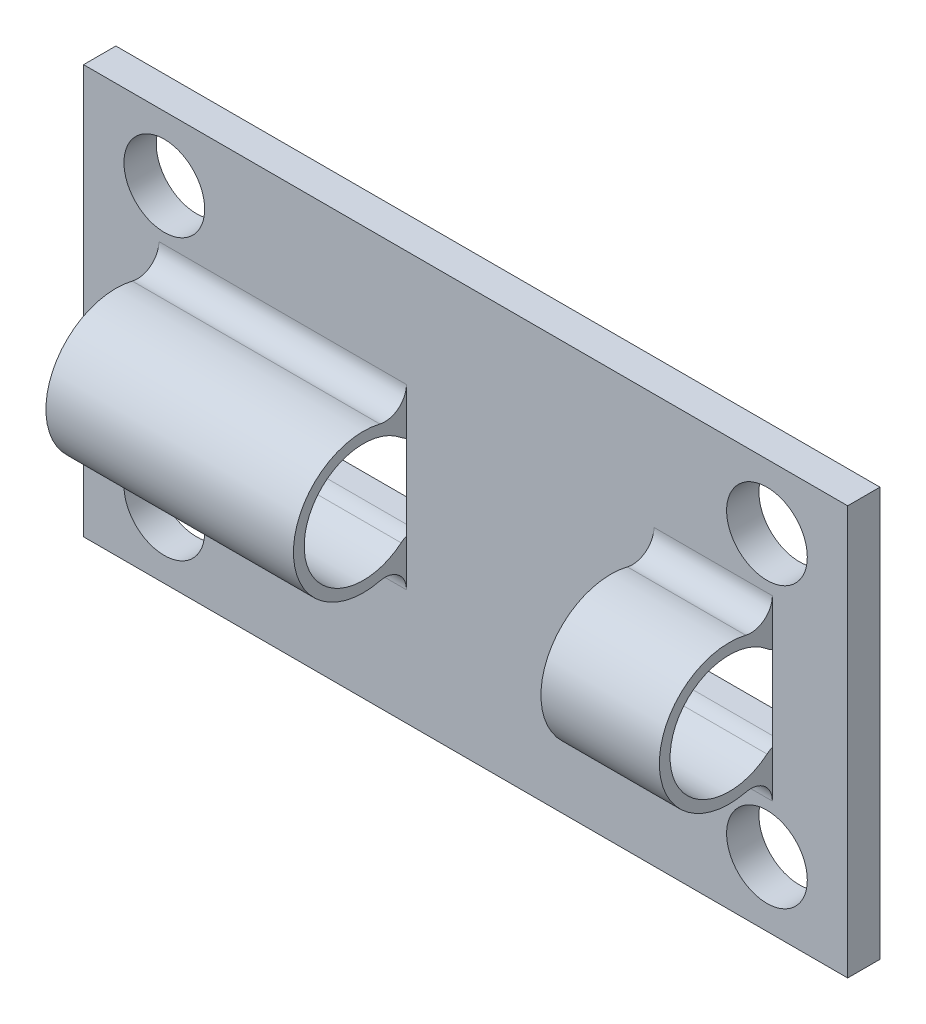
ISO-10303-21;
HEADER;
FILE_DESCRIPTION(('STEP AP214'),'2;1');
FILE_NAME('part.step','',(''),(''),'','','');
FILE_SCHEMA(('AUTOMOTIVE_DESIGN { 1 0 10303 214 1 1 1 1 }'));
ENDSEC;
DATA;
#1=APPLICATION_CONTEXT('core data for automotive mechanical design processes');
#2=APPLICATION_PROTOCOL_DEFINITION('international standard','automotive_design',2000,#1);
#3=PRODUCT_CONTEXT('',#1,'mechanical');
#4=PRODUCT('Part','Part','',(#3));
#5=PRODUCT_RELATED_PRODUCT_CATEGORY('part','',(#4));
#6=PRODUCT_DEFINITION_FORMATION('','',#4);
#7=PRODUCT_DEFINITION_CONTEXT('part definition',#1,'design');
#8=PRODUCT_DEFINITION('design','',#6,#7);
#9=PRODUCT_DEFINITION_SHAPE('','',#8);
#10=(LENGTH_UNIT() NAMED_UNIT(*) SI_UNIT(.MILLI.,.METRE.));
#11=(NAMED_UNIT(*) PLANE_ANGLE_UNIT() SI_UNIT($,.RADIAN.));
#12=(NAMED_UNIT(*) SI_UNIT($,.STERADIAN.) SOLID_ANGLE_UNIT());
#13=UNCERTAINTY_MEASURE_WITH_UNIT(LENGTH_MEASURE(1.E-05),#10,'distance_accuracy_value','');
#14=(GEOMETRIC_REPRESENTATION_CONTEXT(3) GLOBAL_UNCERTAINTY_ASSIGNED_CONTEXT((#13)) GLOBAL_UNIT_ASSIGNED_CONTEXT((#10,
#11,#12)) REPRESENTATION_CONTEXT('',''));
#15=CARTESIAN_POINT('',(0.,0.,0.));
#16=DIRECTION('',(0.,0.,1.));
#17=DIRECTION('',(1.,0.,0.));
#18=AXIS2_PLACEMENT_3D('',#15,#16,#17);
#19=CARTESIAN_POINT('',(17.5,0.,7.));
#20=DIRECTION('',(1.,0.,0.));
#21=DIRECTION('',(0.,0.,-1.));
#22=AXIS2_PLACEMENT_3D('',#19,#20,#21);
#23=CYLINDRICAL_SURFACE('',#22,6.5);
#24=CARTESIAN_POINT('',(17.5,0.,7.));
#25=DIRECTION('',(1.,0.,0.));
#26=DIRECTION('',(0.,0.,-1.));
#27=AXIS2_PLACEMENT_3D('',#24,#25,#26);
#28=CIRCLE('',#27,6.5);
#29=CARTESIAN_POINT('',(17.5,6.31750739247524,5.47058823529412));
#30=VERTEX_POINT('',#29);
#31=CARTESIAN_POINT('',(17.5,-6.31750739247523,5.47058823529412));
#32=VERTEX_POINT('',#31);
#33=EDGE_CURVE('E362',#30,#32,#28,.T.);
#34=ORIENTED_EDGE('',*,*,#33,.T.);
#35=DIRECTION('',(1.,0.,0.));
#36=VECTOR('',#35,1.);
#37=CARTESIAN_POINT('',(17.5,-6.31750739247523,5.47058823529412));
#38=LINE('',#37,#36);
#39=CARTESIAN_POINT('',(28.5,-6.31750739247523,5.47058823529412));
#40=VERTEX_POINT('',#39);
#41=EDGE_CURVE('E570',#32,#40,#38,.T.);
#42=ORIENTED_EDGE('',*,*,#41,.T.);
#43=CARTESIAN_POINT('',(28.5,0.,7.));
#44=DIRECTION('',(1.,0.,0.));
#45=DIRECTION('',(0.,0.,-1.));
#46=AXIS2_PLACEMENT_3D('',#43,#44,#45);
#47=CIRCLE('',#46,6.5);
#48=CARTESIAN_POINT('',(28.5,6.31750739247524,5.47058823529412));
#49=VERTEX_POINT('',#48);
#50=EDGE_CURVE('E602',#49,#40,#47,.T.);
#51=ORIENTED_EDGE('',*,*,#50,.F.);
#52=DIRECTION('',(1.,0.,0.));
#53=VECTOR('',#52,1.);
#54=CARTESIAN_POINT('',(17.5,6.31750739247524,5.47058823529412));
#55=LINE('',#54,#53);
#56=EDGE_CURVE('E566',#49,#30,#55,.F.);
#57=ORIENTED_EDGE('',*,*,#56,.T.);
#58=EDGE_LOOP('',(#34,#42,#51,#57));
#59=FACE_BOUND('',#58,.T.);
#60=ADVANCED_FACE('F99',(#59),#23,.T.);
#61=CARTESIAN_POINT('',(17.5,0.,7.));
#62=DIRECTION('',(1.,0.,0.));
#63=DIRECTION('',(0.,0.,-1.));
#64=AXIS2_PLACEMENT_3D('',#61,#62,#63);
#65=CYLINDRICAL_SURFACE('',#64,5.5);
#66=CARTESIAN_POINT('',(28.5,0.,7.));
#67=DIRECTION('',(-1.,0.,0.));
#68=DIRECTION('',(0.,0.,-1.));
#69=AXIS2_PLACEMENT_3D('',#66,#67,#68);
#70=CIRCLE('',#69,5.5);
#71=CARTESIAN_POINT('',(28.5,-4.2349392929326,3.49068536817009));
#72=VERTEX_POINT('',#71);
#73=CARTESIAN_POINT('',(28.5,4.23493929293261,3.49068536817009));
#74=VERTEX_POINT('',#73);
#75=EDGE_CURVE('E372',#72,#74,#70,.T.);
#76=ORIENTED_EDGE('',*,*,#75,.F.);
#77=DIRECTION('',(1.,0.,0.));
#78=VECTOR('',#77,1.);
#79=CARTESIAN_POINT('',(17.5,-4.2349392929326,3.49068536817009));
#80=LINE('',#79,#78);
#81=CARTESIAN_POINT('',(17.5,-4.2349392929326,3.49068536817009));
#82=VERTEX_POINT('',#81);
#83=EDGE_CURVE('E345',#72,#82,#80,.F.);
#84=ORIENTED_EDGE('',*,*,#83,.T.);
#85=CARTESIAN_POINT('',(17.5,0.,7.));
#86=DIRECTION('',(1.,0.,0.));
#87=DIRECTION('',(0.,0.,-1.));
#88=AXIS2_PLACEMENT_3D('',#85,#86,#87);
#89=CIRCLE('',#88,5.5);
#90=CARTESIAN_POINT('',(17.5,4.23493929293261,3.49068536817009));
#91=VERTEX_POINT('',#90);
#92=EDGE_CURVE('E352',#91,#82,#89,.T.);
#93=ORIENTED_EDGE('',*,*,#92,.F.);
#94=DIRECTION('',(1.,0.,0.));
#95=VECTOR('',#94,1.);
#96=CARTESIAN_POINT('',(17.5,4.23493929293261,3.49068536817009));
#97=LINE('',#96,#95);
#98=EDGE_CURVE('E341',#91,#74,#97,.T.);
#99=ORIENTED_EDGE('',*,*,#98,.T.);
#100=EDGE_LOOP('',(#76,#84,#93,#99));
#101=FACE_BOUND('',#100,.T.);
#102=ADVANCED_FACE('F358',(#101),#65,.F.);
#103=CARTESIAN_POINT('',(-5.5,0.,7.));
#104=DIRECTION('',(-1.,0.,0.));
#105=DIRECTION('',(0.,0.,1.));
#106=AXIS2_PLACEMENT_3D('',#103,#104,#105);
#107=CYLINDRICAL_SURFACE('',#106,6.5);
#108=CARTESIAN_POINT('',(-28.5,0.,7.));
#109=DIRECTION('',(-1.,0.,0.));
#110=DIRECTION('',(0.,0.,1.));
#111=AXIS2_PLACEMENT_3D('',#108,#109,#110);
#112=CIRCLE('',#111,6.5);
#113=CARTESIAN_POINT('',(-28.5,-6.31750739247523,5.47058823529412));
#114=VERTEX_POINT('',#113);
#115=CARTESIAN_POINT('',(-28.5,6.31750739247524,5.47058823529412));
#116=VERTEX_POINT('',#115);
#117=EDGE_CURVE('E394',#114,#116,#112,.T.);
#118=ORIENTED_EDGE('',*,*,#117,.F.);
#119=DIRECTION('',(-1.,0.,0.));
#120=VECTOR('',#119,1.);
#121=CARTESIAN_POINT('',(-5.5,-6.31750739247523,5.47058823529412));
#122=LINE('',#121,#120);
#123=CARTESIAN_POINT('',(-5.5,-6.31750739247523,5.47058823529412));
#124=VERTEX_POINT('',#123);
#125=EDGE_CURVE('E562',#114,#124,#122,.F.);
#126=ORIENTED_EDGE('',*,*,#125,.T.);
#127=CARTESIAN_POINT('',(-5.5,0.,7.));
#128=DIRECTION('',(-1.,0.,0.));
#129=DIRECTION('',(0.,0.,1.));
#130=AXIS2_PLACEMENT_3D('',#127,#128,#129);
#131=CIRCLE('',#130,6.5);
#132=CARTESIAN_POINT('',(-5.5,6.31750739247524,5.47058823529412));
#133=VERTEX_POINT('',#132);
#134=EDGE_CURVE('E363',#124,#133,#131,.T.);
#135=ORIENTED_EDGE('',*,*,#134,.T.);
#136=DIRECTION('',(-1.,0.,0.));
#137=VECTOR('',#136,1.);
#138=CARTESIAN_POINT('',(-5.5,6.31750739247524,5.47058823529412));
#139=LINE('',#138,#137);
#140=EDGE_CURVE('E558',#133,#116,#139,.T.);
#141=ORIENTED_EDGE('',*,*,#140,.T.);
#142=EDGE_LOOP('',(#118,#126,#135,#141));
#143=FACE_BOUND('',#142,.T.);
#144=ADVANCED_FACE('F704',(#143),#107,.T.);
#145=CARTESIAN_POINT('',(-5.5,0.,7.));
#146=DIRECTION('',(-1.,0.,0.));
#147=DIRECTION('',(0.,0.,1.));
#148=AXIS2_PLACEMENT_3D('',#145,#146,#147);
#149=CYLINDRICAL_SURFACE('',#148,5.5);
#150=CARTESIAN_POINT('',(-28.5,0.,7.));
#151=DIRECTION('',(1.,0.,0.));
#152=DIRECTION('',(0.,0.,1.));
#153=AXIS2_PLACEMENT_3D('',#150,#151,#152);
#154=CIRCLE('',#153,5.5);
#155=CARTESIAN_POINT('',(-28.5,4.23493929293261,3.4906853681701));
#156=VERTEX_POINT('',#155);
#157=CARTESIAN_POINT('',(-28.5,-4.2349392929326,3.4906853681701));
#158=VERTEX_POINT('',#157);
#159=EDGE_CURVE('E380',#156,#158,#154,.T.);
#160=ORIENTED_EDGE('',*,*,#159,.F.);
#161=DIRECTION('',(-1.,0.,0.));
#162=VECTOR('',#161,1.);
#163=CARTESIAN_POINT('',(-5.5,4.23493929293261,3.4906853681701));
#164=LINE('',#163,#162);
#165=CARTESIAN_POINT('',(-5.5,4.23493929293261,3.4906853681701));
#166=VERTEX_POINT('',#165);
#167=EDGE_CURVE('E326',#156,#166,#164,.F.);
#168=ORIENTED_EDGE('',*,*,#167,.T.);
#169=CARTESIAN_POINT('',(-5.5,0.,7.));
#170=DIRECTION('',(-1.,0.,0.));
#171=DIRECTION('',(0.,0.,1.));
#172=AXIS2_PLACEMENT_3D('',#169,#170,#171);
#173=CIRCLE('',#172,5.5);
#174=CARTESIAN_POINT('',(-5.5,-4.2349392929326,3.4906853681701));
#175=VERTEX_POINT('',#174);
#176=EDGE_CURVE('E446',#175,#166,#173,.T.);
#177=ORIENTED_EDGE('',*,*,#176,.F.);
#178=DIRECTION('',(-1.,0.,0.));
#179=VECTOR('',#178,1.);
#180=CARTESIAN_POINT('',(-5.5,-4.2349392929326,3.4906853681701));
#181=LINE('',#180,#179);
#182=EDGE_CURVE('E323',#175,#158,#181,.T.);
#183=ORIENTED_EDGE('',*,*,#182,.T.);
#184=EDGE_LOOP('',(#160,#168,#177,#183));
#185=FACE_BOUND('',#184,.T.);
#186=ADVANCED_FACE('F694',(#185),#149,.F.);
#187=CARTESIAN_POINT('',(0.,0.,0.));
#188=DIRECTION('',(0.,0.,-1.));
#189=DIRECTION('',(-1.,0.,0.));
#190=AXIS2_PLACEMENT_3D('',#187,#188,#189);
#191=PLANE('',#190);
#192=CARTESIAN_POINT('',(-28.,-13.,0.));
#193=DIRECTION('',(0.,0.,1.));
#194=DIRECTION('',(1.,0.,0.));
#195=AXIS2_PLACEMENT_3D('',#192,#193,#194);
#196=CIRCLE('',#195,3.75);
#197=CARTESIAN_POINT('',(-24.25,-13.,0.));
#198=VERTEX_POINT('',#197);
#199=EDGE_CURVE('E461',#198,#198,#196,.T.);
#200=ORIENTED_EDGE('',*,*,#199,.T.);
#201=EDGE_LOOP('',(#200));
#202=FACE_BOUND('',#201,.T.);
#203=CARTESIAN_POINT('',(-28.,13.,0.));
#204=DIRECTION('',(0.,0.,1.));
#205=DIRECTION('',(1.,0.,0.));
#206=AXIS2_PLACEMENT_3D('',#203,#204,#205);
#207=CIRCLE('',#206,3.75);
#208=CARTESIAN_POINT('',(-24.25,13.,0.));
#209=VERTEX_POINT('',#208);
#210=EDGE_CURVE('E477',#209,#209,#207,.T.);
#211=ORIENTED_EDGE('',*,*,#210,.T.);
#212=EDGE_LOOP('',(#211));
#213=FACE_BOUND('',#212,.T.);
#214=DIRECTION('',(0.,1.,0.));
#215=VECTOR('',#214,1.);
#216=CARTESIAN_POINT('',(-35.5,-19.,0.));
#217=LINE('',#216,#215);
#218=CARTESIAN_POINT('',(-35.5,-19.,0.));
#219=VERTEX_POINT('',#218);
#220=CARTESIAN_POINT('',(-35.5,19.,0.));
#221=VERTEX_POINT('',#220);
#222=EDGE_CURVE('E485',#219,#221,#217,.T.);
#223=ORIENTED_EDGE('',*,*,#222,.T.);
#224=DIRECTION('',(1.,0.,0.));
#225=VECTOR('',#224,1.);
#226=CARTESIAN_POINT('',(-35.5,19.,0.));
#227=LINE('',#226,#225);
#228=CARTESIAN_POINT('',(35.5,19.,0.));
#229=VERTEX_POINT('',#228);
#230=EDGE_CURVE('E510',#221,#229,#227,.T.);
#231=ORIENTED_EDGE('',*,*,#230,.T.);
#232=DIRECTION('',(0.,1.,0.));
#233=VECTOR('',#232,1.);
#234=CARTESIAN_POINT('',(35.5,-19.,0.));
#235=LINE('',#234,#233);
#236=CARTESIAN_POINT('',(35.5,-19.,0.));
#237=VERTEX_POINT('',#236);
#238=EDGE_CURVE('E514',#237,#229,#235,.T.);
#239=ORIENTED_EDGE('',*,*,#238,.F.);
#240=DIRECTION('',(1.,0.,0.));
#241=VECTOR('',#240,1.);
#242=CARTESIAN_POINT('',(-35.5,-19.,0.));
#243=LINE('',#242,#241);
#244=EDGE_CURVE('E494',#219,#237,#243,.T.);
#245=ORIENTED_EDGE('',*,*,#244,.F.);
#246=EDGE_LOOP('',(#223,#231,#239,#245));
#247=FACE_BOUND('',#246,.T.);
#248=CARTESIAN_POINT('',(28.,13.,0.));
#249=DIRECTION('',(0.,0.,1.));
#250=DIRECTION('',(1.,0.,0.));
#251=AXIS2_PLACEMENT_3D('',#248,#249,#250);
#252=CIRCLE('',#251,3.75);
#253=CARTESIAN_POINT('',(31.75,13.,0.));
#254=VERTEX_POINT('',#253);
#255=EDGE_CURVE('E469',#254,#254,#252,.T.);
#256=ORIENTED_EDGE('',*,*,#255,.T.);
#257=EDGE_LOOP('',(#256));
#258=FACE_BOUND('',#257,.T.);
#259=CARTESIAN_POINT('',(28.,-13.,0.));
#260=DIRECTION('',(0.,0.,1.));
#261=DIRECTION('',(1.,0.,0.));
#262=AXIS2_PLACEMENT_3D('',#259,#260,#261);
#263=CIRCLE('',#262,3.75000000000001);
#264=CARTESIAN_POINT('',(31.75,-13.,0.));
#265=VERTEX_POINT('',#264);
#266=EDGE_CURVE('E456',#265,#265,#263,.T.);
#267=ORIENTED_EDGE('',*,*,#266,.T.);
#268=EDGE_LOOP('',(#267));
#269=FACE_BOUND('',#268,.T.);
#270=DIRECTION('',(1.,0.,0.));
#271=VECTOR('',#270,1.);
#272=CARTESIAN_POINT('',(0.,-3.77491721763537,0.));
#273=LINE('',#272,#271);
#274=CARTESIAN_POINT('',(-28.5,-3.77491721763537,0.));
#275=VERTEX_POINT('',#274);
#276=CARTESIAN_POINT('',(-5.5,-3.77491721763537,0.));
#277=VERTEX_POINT('',#276);
#278=EDGE_CURVE('E428',#275,#277,#273,.T.);
#279=ORIENTED_EDGE('',*,*,#278,.T.);
#280=DIRECTION('',(0.,1.,0.));
#281=VECTOR('',#280,1.);
#282=CARTESIAN_POINT('',(-5.5,0.,0.));
#283=LINE('',#282,#281);
#284=CARTESIAN_POINT('',(-5.5,3.77491721763538,0.));
#285=VERTEX_POINT('',#284);
#286=EDGE_CURVE('E226',#277,#285,#283,.T.);
#287=ORIENTED_EDGE('',*,*,#286,.T.);
#288=DIRECTION('',(1.,0.,0.));
#289=VECTOR('',#288,1.);
#290=CARTESIAN_POINT('',(0.,3.77491721763538,0.));
#291=LINE('',#290,#289);
#292=CARTESIAN_POINT('',(-28.5,3.77491721763537,0.));
#293=VERTEX_POINT('',#292);
#294=EDGE_CURVE('E302',#293,#285,#291,.T.);
#295=ORIENTED_EDGE('',*,*,#294,.F.);
#296=DIRECTION('',(0.,1.,0.));
#297=VECTOR('',#296,1.);
#298=CARTESIAN_POINT('',(-28.5,0.,0.));
#299=LINE('',#298,#297);
#300=EDGE_CURVE('E424',#275,#293,#299,.T.);
#301=ORIENTED_EDGE('',*,*,#300,.F.);
#302=EDGE_LOOP('',(#279,#287,#295,#301));
#303=FACE_BOUND('',#302,.T.);
#304=DIRECTION('',(-1.,0.,0.));
#305=VECTOR('',#304,1.);
#306=CARTESIAN_POINT('',(0.,-3.77491721763537,0.));
#307=LINE('',#306,#305);
#308=CARTESIAN_POINT('',(28.5,-3.77491721763537,0.));
#309=VERTEX_POINT('',#308);
#310=CARTESIAN_POINT('',(17.5,-3.77491721763537,0.));
#311=VERTEX_POINT('',#310);
#312=EDGE_CURVE('E439',#309,#311,#307,.T.);
#313=ORIENTED_EDGE('',*,*,#312,.F.);
#314=DIRECTION('',(0.,1.,0.));
#315=VECTOR('',#314,1.);
#316=CARTESIAN_POINT('',(28.5,0.,0.));
#317=LINE('',#316,#315);
#318=CARTESIAN_POINT('',(28.5,3.77491721763538,0.));
#319=VERTEX_POINT('',#318);
#320=EDGE_CURVE('E443',#309,#319,#317,.T.);
#321=ORIENTED_EDGE('',*,*,#320,.T.);
#322=DIRECTION('',(1.,0.,0.));
#323=VECTOR('',#322,1.);
#324=CARTESIAN_POINT('',(0.,3.77491721763538,0.));
#325=LINE('',#324,#323);
#326=CARTESIAN_POINT('',(17.5,3.77491721763538,0.));
#327=VERTEX_POINT('',#326);
#328=EDGE_CURVE('E263',#327,#319,#325,.T.);
#329=ORIENTED_EDGE('',*,*,#328,.F.);
#330=DIRECTION('',(0.,1.,0.));
#331=VECTOR('',#330,1.);
#332=CARTESIAN_POINT('',(17.5,0.,0.));
#333=LINE('',#332,#331);
#334=EDGE_CURVE('E435',#311,#327,#333,.T.);
#335=ORIENTED_EDGE('',*,*,#334,.F.);
#336=EDGE_LOOP('',(#313,#321,#329,#335));
#337=FACE_BOUND('',#336,.T.);
#338=ADVANCED_FACE('F666',(#202,#213,#247,#258,#269,#303,#337),#191,.T.);
#339=CARTESIAN_POINT('',(0.,0.,3.));
#340=DIRECTION('',(0.,0.,-1.));
#341=DIRECTION('',(-1.,0.,0.));
#342=AXIS2_PLACEMENT_3D('',#339,#340,#341);
#343=PLANE('',#342);
#344=DIRECTION('',(0.,1.,0.));
#345=VECTOR('',#344,1.);
#346=CARTESIAN_POINT('',(35.5,-19.,3.));
#347=LINE('',#346,#345);
#348=CARTESIAN_POINT('',(35.5,-19.,3.));
#349=VERTEX_POINT('',#348);
#350=CARTESIAN_POINT('',(35.5,19.,3.));
#351=VERTEX_POINT('',#350);
#352=EDGE_CURVE('E498',#349,#351,#347,.T.);
#353=ORIENTED_EDGE('',*,*,#352,.T.);
#354=DIRECTION('',(1.,0.,0.));
#355=VECTOR('',#354,1.);
#356=CARTESIAN_POINT('',(-35.5,19.,3.));
#357=LINE('',#356,#355);
#358=CARTESIAN_POINT('',(-35.5,19.,3.));
#359=VERTEX_POINT('',#358);
#360=EDGE_CURVE('E493',#359,#351,#357,.T.);
#361=ORIENTED_EDGE('',*,*,#360,.F.);
#362=DIRECTION('',(0.,1.,0.));
#363=VECTOR('',#362,1.);
#364=CARTESIAN_POINT('',(-35.5,-19.,3.));
#365=LINE('',#364,#363);
#366=CARTESIAN_POINT('',(-35.5,-19.,3.));
#367=VERTEX_POINT('',#366);
#368=EDGE_CURVE('E489',#367,#359,#365,.T.);
#369=ORIENTED_EDGE('',*,*,#368,.F.);
#370=DIRECTION('',(1.,0.,0.));
#371=VECTOR('',#370,1.);
#372=CARTESIAN_POINT('',(-35.5,-19.,3.));
#373=LINE('',#372,#371);
#374=EDGE_CURVE('E502',#367,#349,#373,.T.);
#375=ORIENTED_EDGE('',*,*,#374,.T.);
#376=EDGE_LOOP('',(#353,#361,#369,#375));
#377=FACE_BOUND('',#376,.T.);
#378=DIRECTION('',(-1.,0.,0.));
#379=VECTOR('',#378,1.);
#380=CARTESIAN_POINT('',(0.,-8.26135582092915,3.));
#381=LINE('',#380,#379);
#382=CARTESIAN_POINT('',(-5.5,-8.26135582092915,3.));
#383=VERTEX_POINT('',#382);
#384=CARTESIAN_POINT('',(-28.5,-8.26135582092915,3.));
#385=VERTEX_POINT('',#384);
#386=EDGE_CURVE('E554',#383,#385,#381,.T.);
#387=ORIENTED_EDGE('',*,*,#386,.T.);
#388=DIRECTION('',(0.,-1.,0.));
#389=VECTOR('',#388,1.);
#390=CARTESIAN_POINT('',(-28.5,-3.77491721763537,3.));
#391=LINE('',#390,#389);
#392=CARTESIAN_POINT('',(-28.5,-3.93559635987922,3.));
#393=VERTEX_POINT('',#392);
#394=EDGE_CURVE('E385',#393,#385,#391,.T.);
#395=ORIENTED_EDGE('',*,*,#394,.F.);
#396=DIRECTION('',(0.,-1.,0.));
#397=VECTOR('',#396,1.);
#398=CARTESIAN_POINT('',(-28.5,3.77491721763537,3.));
#399=LINE('',#398,#397);
#400=CARTESIAN_POINT('',(-28.5,3.93559635987923,3.));
#401=VERTEX_POINT('',#400);
#402=EDGE_CURVE('E180',#401,#393,#399,.T.);
#403=ORIENTED_EDGE('',*,*,#402,.F.);
#404=DIRECTION('',(0.,-1.,0.));
#405=VECTOR('',#404,1.);
#406=CARTESIAN_POINT('',(-28.5,3.77491721763538,3.));
#407=LINE('',#406,#405);
#408=CARTESIAN_POINT('',(-28.5,8.26135582092916,3.));
#409=VERTEX_POINT('',#408);
#410=EDGE_CURVE('E228',#409,#401,#407,.T.);
#411=ORIENTED_EDGE('',*,*,#410,.F.);
#412=DIRECTION('',(-1.,0.,0.));
#413=VECTOR('',#412,1.);
#414=CARTESIAN_POINT('',(0.,8.26135582092916,3.));
#415=LINE('',#414,#413);
#416=CARTESIAN_POINT('',(-5.5,8.26135582092916,3.));
#417=VERTEX_POINT('',#416);
#418=EDGE_CURVE('E547',#409,#417,#415,.F.);
#419=ORIENTED_EDGE('',*,*,#418,.T.);
#420=DIRECTION('',(0.,1.,0.));
#421=VECTOR('',#420,1.);
#422=CARTESIAN_POINT('',(-5.5,0.,3.));
#423=LINE('',#422,#421);
#424=CARTESIAN_POINT('',(-5.5,3.93559635987923,3.));
#425=VERTEX_POINT('',#424);
#426=EDGE_CURVE('E540',#425,#417,#423,.T.);
#427=ORIENTED_EDGE('',*,*,#426,.F.);
#428=DIRECTION('',(0.,-1.,0.));
#429=VECTOR('',#428,1.);
#430=CARTESIAN_POINT('',(-5.5,3.77491721763538,3.));
#431=LINE('',#430,#429);
#432=CARTESIAN_POINT('',(-5.5,-3.93559635987922,3.));
#433=VERTEX_POINT('',#432);
#434=EDGE_CURVE('E287',#425,#433,#431,.T.);
#435=ORIENTED_EDGE('',*,*,#434,.T.);
#436=EDGE_CURVE('E544',#383,#433,#423,.T.);
#437=ORIENTED_EDGE('',*,*,#436,.F.);
#438=EDGE_LOOP('',(#387,#395,#403,#411,#419,#427,#435,#437));
#439=FACE_BOUND('',#438,.T.);
#440=DIRECTION('',(1.,0.,0.));
#441=VECTOR('',#440,1.);
#442=CARTESIAN_POINT('',(0.,-8.26135582092915,3.));
#443=LINE('',#442,#441);
#444=CARTESIAN_POINT('',(28.5,-8.26135582092915,3.));
#445=VERTEX_POINT('',#444);
#446=CARTESIAN_POINT('',(17.5,-8.26135582092915,3.));
#447=VERTEX_POINT('',#446);
#448=EDGE_CURVE('E551',#445,#447,#443,.F.);
#449=ORIENTED_EDGE('',*,*,#448,.T.);
#450=DIRECTION('',(0.,-1.,0.));
#451=VECTOR('',#450,1.);
#452=CARTESIAN_POINT('',(17.5,0.,3.));
#453=LINE('',#452,#451);
#454=CARTESIAN_POINT('',(17.5,-3.93559635987922,3.));
#455=VERTEX_POINT('',#454);
#456=EDGE_CURVE('E525',#455,#447,#453,.T.);
#457=ORIENTED_EDGE('',*,*,#456,.F.);
#458=DIRECTION('',(0.,-1.,0.));
#459=VECTOR('',#458,1.);
#460=CARTESIAN_POINT('',(17.5,0.,3.));
#461=LINE('',#460,#459);
#462=CARTESIAN_POINT('',(17.5,3.93559635987923,3.));
#463=VERTEX_POINT('',#462);
#464=EDGE_CURVE('E115',#463,#455,#461,.T.);
#465=ORIENTED_EDGE('',*,*,#464,.F.);
#466=CARTESIAN_POINT('',(17.5,8.26135582092916,3.));
#467=VERTEX_POINT('',#466);
#468=EDGE_CURVE('E354',#467,#463,#453,.T.);
#469=ORIENTED_EDGE('',*,*,#468,.F.);
#470=DIRECTION('',(1.,0.,0.));
#471=VECTOR('',#470,1.);
#472=CARTESIAN_POINT('',(0.,8.26135582092916,3.));
#473=LINE('',#472,#471);
#474=CARTESIAN_POINT('',(28.5,8.26135582092916,3.));
#475=VERTEX_POINT('',#474);
#476=EDGE_CURVE('E378',#467,#475,#473,.T.);
#477=ORIENTED_EDGE('',*,*,#476,.T.);
#478=DIRECTION('',(0.,1.,0.));
#479=VECTOR('',#478,1.);
#480=CARTESIAN_POINT('',(28.5,5.1234753829798,3.));
#481=LINE('',#480,#479);
#482=CARTESIAN_POINT('',(28.5,3.93559635987923,3.));
#483=VERTEX_POINT('',#482);
#484=EDGE_CURVE('E370',#483,#475,#481,.T.);
#485=ORIENTED_EDGE('',*,*,#484,.F.);
#486=DIRECTION('',(0.,-1.,0.));
#487=VECTOR('',#486,1.);
#488=CARTESIAN_POINT('',(28.5,0.,3.));
#489=LINE('',#488,#487);
#490=CARTESIAN_POINT('',(28.5,-3.93559635987922,3.));
#491=VERTEX_POINT('',#490);
#492=EDGE_CURVE('E123',#483,#491,#489,.T.);
#493=ORIENTED_EDGE('',*,*,#492,.T.);
#494=DIRECTION('',(0.,1.,0.));
#495=VECTOR('',#494,1.);
#496=CARTESIAN_POINT('',(28.5,-3.77491721763537,3.));
#497=LINE('',#496,#495);
#498=EDGE_CURVE('E387',#445,#491,#497,.T.);
#499=ORIENTED_EDGE('',*,*,#498,.F.);
#500=EDGE_LOOP('',(#449,#457,#465,#469,#477,#485,#493,#499));
#501=FACE_BOUND('',#500,.T.);
#502=CARTESIAN_POINT('',(-28.,13.,3.));
#503=DIRECTION('',(0.,0.,1.));
#504=DIRECTION('',(1.,0.,0.));
#505=AXIS2_PLACEMENT_3D('',#502,#503,#504);
#506=CIRCLE('',#505,3.75);
#507=CARTESIAN_POINT('',(-24.25,13.,3.));
#508=VERTEX_POINT('',#507);
#509=EDGE_CURVE('E481',#508,#508,#506,.T.);
#510=ORIENTED_EDGE('',*,*,#509,.F.);
#511=EDGE_LOOP('',(#510));
#512=FACE_BOUND('',#511,.T.);
#513=CARTESIAN_POINT('',(28.,13.,3.));
#514=DIRECTION('',(0.,0.,1.));
#515=DIRECTION('',(1.,0.,0.));
#516=AXIS2_PLACEMENT_3D('',#513,#514,#515);
#517=CIRCLE('',#516,3.75);
#518=CARTESIAN_POINT('',(31.75,13.,3.));
#519=VERTEX_POINT('',#518);
#520=EDGE_CURVE('E473',#519,#519,#517,.T.);
#521=ORIENTED_EDGE('',*,*,#520,.F.);
#522=EDGE_LOOP('',(#521));
#523=FACE_BOUND('',#522,.T.);
#524=CARTESIAN_POINT('',(-28.,-13.,3.));
#525=DIRECTION('',(0.,0.,1.));
#526=DIRECTION('',(1.,0.,0.));
#527=AXIS2_PLACEMENT_3D('',#524,#525,#526);
#528=CIRCLE('',#527,3.75);
#529=CARTESIAN_POINT('',(-24.25,-13.,3.));
#530=VERTEX_POINT('',#529);
#531=EDGE_CURVE('E465',#530,#530,#528,.T.);
#532=ORIENTED_EDGE('',*,*,#531,.F.);
#533=EDGE_LOOP('',(#532));
#534=FACE_BOUND('',#533,.T.);
#535=CARTESIAN_POINT('',(28.,-13.,3.));
#536=DIRECTION('',(0.,0.,1.));
#537=DIRECTION('',(1.,0.,0.));
#538=AXIS2_PLACEMENT_3D('',#535,#536,#537);
#539=CIRCLE('',#538,3.75000000000001);
#540=CARTESIAN_POINT('',(31.75,-13.,3.));
#541=VERTEX_POINT('',#540);
#542=EDGE_CURVE('E457',#541,#541,#539,.T.);
#543=ORIENTED_EDGE('',*,*,#542,.F.);
#544=EDGE_LOOP('',(#543));
#545=FACE_BOUND('',#544,.T.);
#546=ADVANCED_FACE('F375',(#377,#439,#501,#512,#523,#534,#545),#343,.F.);
#547=CARTESIAN_POINT('',(-35.5,-19.,3.));
#548=DIRECTION('',(-1.,0.,0.));
#549=DIRECTION('',(0.,0.,1.));
#550=AXIS2_PLACEMENT_3D('',#547,#548,#549);
#551=PLANE('',#550);
#552=ORIENTED_EDGE('',*,*,#368,.T.);
#553=DIRECTION('',(0.,0.,-1.));
#554=VECTOR('',#553,1.);
#555=CARTESIAN_POINT('',(-35.5,19.,3.));
#556=LINE('',#555,#554);
#557=EDGE_CURVE('E506',#359,#221,#556,.T.);
#558=ORIENTED_EDGE('',*,*,#557,.T.);
#559=ORIENTED_EDGE('',*,*,#222,.F.);
#560=DIRECTION('',(0.,0.,-1.));
#561=VECTOR('',#560,1.);
#562=CARTESIAN_POINT('',(-35.5,-19.,3.));
#563=LINE('',#562,#561);
#564=EDGE_CURVE('E521',#367,#219,#563,.T.);
#565=ORIENTED_EDGE('',*,*,#564,.F.);
#566=EDGE_LOOP('',(#552,#558,#559,#565));
#567=FACE_BOUND('',#566,.T.);
#568=ADVANCED_FACE('F701',(#567),#551,.T.);
#569=CARTESIAN_POINT('',(-35.5,-19.,3.));
#570=DIRECTION('',(0.,1.,0.));
#571=DIRECTION('',(0.,0.,1.));
#572=AXIS2_PLACEMENT_3D('',#569,#570,#571);
#573=PLANE('',#572);
#574=ORIENTED_EDGE('',*,*,#244,.T.);
#575=DIRECTION('',(0.,0.,-1.));
#576=VECTOR('',#575,1.);
#577=CARTESIAN_POINT('',(35.5,-19.,3.));
#578=LINE('',#577,#576);
#579=EDGE_CURVE('E526',#349,#237,#578,.T.);
#580=ORIENTED_EDGE('',*,*,#579,.F.);
#581=ORIENTED_EDGE('',*,*,#374,.F.);
#582=ORIENTED_EDGE('',*,*,#564,.T.);
#583=EDGE_LOOP('',(#574,#580,#581,#582));
#584=FACE_BOUND('',#583,.T.);
#585=ADVANCED_FACE('F763',(#584),#573,.F.);
#586=CARTESIAN_POINT('',(35.5,-19.,3.));
#587=DIRECTION('',(-1.,0.,0.));
#588=DIRECTION('',(0.,0.,1.));
#589=AXIS2_PLACEMENT_3D('',#586,#587,#588);
#590=PLANE('',#589);
#591=DIRECTION('',(0.,0.,-1.));
#592=VECTOR('',#591,1.);
#593=CARTESIAN_POINT('',(35.5,19.,3.));
#594=LINE('',#593,#592);
#595=EDGE_CURVE('E530',#351,#229,#594,.T.);
#596=ORIENTED_EDGE('',*,*,#595,.F.);
#597=ORIENTED_EDGE('',*,*,#352,.F.);
#598=ORIENTED_EDGE('',*,*,#579,.T.);
#599=ORIENTED_EDGE('',*,*,#238,.T.);
#600=EDGE_LOOP('',(#596,#597,#598,#599));
#601=FACE_BOUND('',#600,.T.);
#602=ADVANCED_FACE('F736',(#601),#590,.F.);
#603=CARTESIAN_POINT('',(-35.5,19.,3.));
#604=DIRECTION('',(0.,1.,0.));
#605=DIRECTION('',(0.,0.,1.));
#606=AXIS2_PLACEMENT_3D('',#603,#604,#605);
#607=PLANE('',#606);
#608=ORIENTED_EDGE('',*,*,#230,.F.);
#609=ORIENTED_EDGE('',*,*,#557,.F.);
#610=ORIENTED_EDGE('',*,*,#360,.T.);
#611=ORIENTED_EDGE('',*,*,#595,.T.);
#612=EDGE_LOOP('',(#608,#609,#610,#611));
#613=FACE_BOUND('',#612,.T.);
#614=ADVANCED_FACE('F731',(#613),#607,.T.);
#615=CARTESIAN_POINT('',(-28.,13.,3.));
#616=DIRECTION('',(0.,0.,-1.));
#617=DIRECTION('',(-1.,0.,0.));
#618=AXIS2_PLACEMENT_3D('',#615,#616,#617);
#619=CYLINDRICAL_SURFACE('',#618,3.75);
#620=ORIENTED_EDGE('',*,*,#509,.T.);
#621=EDGE_LOOP('',(#620));
#622=FACE_BOUND('',#621,.T.);
#623=ORIENTED_EDGE('',*,*,#210,.F.);
#624=EDGE_LOOP('',(#623));
#625=FACE_BOUND('',#624,.T.);
#626=ADVANCED_FACE('F728',(#622,#625),#619,.F.);
#627=CARTESIAN_POINT('',(28.,13.,3.));
#628=DIRECTION('',(0.,0.,-1.));
#629=DIRECTION('',(-1.,0.,0.));
#630=AXIS2_PLACEMENT_3D('',#627,#628,#629);
#631=CYLINDRICAL_SURFACE('',#630,3.75);
#632=ORIENTED_EDGE('',*,*,#520,.T.);
#633=EDGE_LOOP('',(#632));
#634=FACE_BOUND('',#633,.T.);
#635=ORIENTED_EDGE('',*,*,#255,.F.);
#636=EDGE_LOOP('',(#635));
#637=FACE_BOUND('',#636,.T.);
#638=ADVANCED_FACE('F724',(#634,#637),#631,.F.);
#639=CARTESIAN_POINT('',(-28.,-13.,3.));
#640=DIRECTION('',(0.,0.,-1.));
#641=DIRECTION('',(-1.,0.,0.));
#642=AXIS2_PLACEMENT_3D('',#639,#640,#641);
#643=CYLINDRICAL_SURFACE('',#642,3.75);
#644=ORIENTED_EDGE('',*,*,#531,.T.);
#645=EDGE_LOOP('',(#644));
#646=FACE_BOUND('',#645,.T.);
#647=ORIENTED_EDGE('',*,*,#199,.F.);
#648=EDGE_LOOP('',(#647));
#649=FACE_BOUND('',#648,.T.);
#650=ADVANCED_FACE('F720',(#646,#649),#643,.F.);
#651=CARTESIAN_POINT('',(28.,-13.,3.));
#652=DIRECTION('',(0.,0.,-1.));
#653=DIRECTION('',(-1.,0.,0.));
#654=AXIS2_PLACEMENT_3D('',#651,#652,#653);
#655=CYLINDRICAL_SURFACE('',#654,3.75000000000001);
#656=ORIENTED_EDGE('',*,*,#542,.T.);
#657=EDGE_LOOP('',(#656));
#658=FACE_BOUND('',#657,.T.);
#659=ORIENTED_EDGE('',*,*,#266,.F.);
#660=EDGE_LOOP('',(#659));
#661=FACE_BOUND('',#660,.T.);
#662=ADVANCED_FACE('F717',(#658,#661),#655,.F.);
#663=CARTESIAN_POINT('',(17.5,0.,7.));
#664=DIRECTION('',(1.,0.,0.));
#665=DIRECTION('',(0.,0.,-1.));
#666=AXIS2_PLACEMENT_3D('',#663,#664,#665);
#667=PLANE('',#666);
#668=ORIENTED_EDGE('',*,*,#92,.T.);
#669=CARTESIAN_POINT('',(17.5,-5.77491721763537,2.21457095659558));
#670=DIRECTION('',(1.,0.,0.));
#671=DIRECTION('',(0.,0.,-1.));
#672=AXIS2_PLACEMENT_3D('',#669,#670,#671);
#673=CIRCLE('',#672,2.);
#674=EDGE_CURVE('E271',#82,#455,#673,.F.);
#675=ORIENTED_EDGE('',*,*,#674,.T.);
#676=ORIENTED_EDGE('',*,*,#456,.T.);
#677=CARTESIAN_POINT('',(17.5,-8.26135582092915,5.));
#678=DIRECTION('',(1.,0.,0.));
#679=DIRECTION('',(0.,0.,-1.));
#680=AXIS2_PLACEMENT_3D('',#677,#678,#679);
#681=CIRCLE('',#680,2.);
#682=EDGE_CURVE('E582',#447,#32,#681,.T.);
#683=ORIENTED_EDGE('',*,*,#682,.T.);
#684=ORIENTED_EDGE('',*,*,#33,.F.);
#685=CARTESIAN_POINT('',(17.5,8.26135582092916,5.));
#686=DIRECTION('',(1.,0.,0.));
#687=DIRECTION('',(0.,0.,-1.));
#688=AXIS2_PLACEMENT_3D('',#685,#686,#687);
#689=CIRCLE('',#688,2.);
#690=EDGE_CURVE('E310',#30,#467,#689,.T.);
#691=ORIENTED_EDGE('',*,*,#690,.T.);
#692=ORIENTED_EDGE('',*,*,#468,.T.);
#693=CARTESIAN_POINT('',(17.5,5.77491721763538,2.21457095659558));
#694=DIRECTION('',(1.,0.,0.));
#695=DIRECTION('',(0.,0.,-1.));
#696=AXIS2_PLACEMENT_3D('',#693,#694,#695);
#697=CIRCLE('',#696,2.);
#698=EDGE_CURVE('E277',#463,#91,#697,.F.);
#699=ORIENTED_EDGE('',*,*,#698,.T.);
#700=EDGE_LOOP('',(#668,#675,#676,#683,#684,#691,#692,#699));
#701=FACE_BOUND('',#700,.T.);
#702=ADVANCED_FACE('F351',(#701),#667,.F.);
#703=CARTESIAN_POINT('',(-5.5,0.,7.));
#704=DIRECTION('',(-1.,0.,0.));
#705=DIRECTION('',(0.,0.,1.));
#706=AXIS2_PLACEMENT_3D('',#703,#704,#705);
#707=PLANE('',#706);
#708=ORIENTED_EDGE('',*,*,#176,.T.);
#709=CARTESIAN_POINT('',(-5.5,5.77491721763538,2.21457095659558));
#710=DIRECTION('',(-1.,0.,0.));
#711=DIRECTION('',(0.,0.,1.));
#712=AXIS2_PLACEMENT_3D('',#709,#710,#711);
#713=CIRCLE('',#712,2.);
#714=EDGE_CURVE('E216',#166,#425,#713,.F.);
#715=ORIENTED_EDGE('',*,*,#714,.T.);
#716=ORIENTED_EDGE('',*,*,#426,.T.);
#717=CARTESIAN_POINT('',(-5.5,8.26135582092916,5.));
#718=DIRECTION('',(-1.,0.,0.));
#719=DIRECTION('',(0.,0.,1.));
#720=AXIS2_PLACEMENT_3D('',#717,#718,#719);
#721=CIRCLE('',#720,2.);
#722=EDGE_CURVE('E590',#417,#133,#721,.T.);
#723=ORIENTED_EDGE('',*,*,#722,.T.);
#724=ORIENTED_EDGE('',*,*,#134,.F.);
#725=CARTESIAN_POINT('',(-5.5,-8.26135582092915,5.));
#726=DIRECTION('',(-1.,0.,0.));
#727=DIRECTION('',(0.,0.,1.));
#728=AXIS2_PLACEMENT_3D('',#725,#726,#727);
#729=CIRCLE('',#728,2.);
#730=EDGE_CURVE('E578',#124,#383,#729,.T.);
#731=ORIENTED_EDGE('',*,*,#730,.T.);
#732=ORIENTED_EDGE('',*,*,#436,.T.);
#733=CARTESIAN_POINT('',(-5.5,-5.77491721763537,2.21457095659558));
#734=DIRECTION('',(-1.,0.,0.));
#735=DIRECTION('',(0.,0.,1.));
#736=AXIS2_PLACEMENT_3D('',#733,#734,#735);
#737=CIRCLE('',#736,2.);
#738=EDGE_CURVE('E231',#433,#175,#737,.F.);
#739=ORIENTED_EDGE('',*,*,#738,.T.);
#740=EDGE_LOOP('',(#708,#715,#716,#723,#724,#731,#732,#739));
#741=FACE_BOUND('',#740,.T.);
#742=ADVANCED_FACE('F788',(#741),#707,.F.);
#743=CARTESIAN_POINT('',(-5.5,3.77491721763538,-27.));
#744=DIRECTION('',(-1.,0.,0.));
#745=DIRECTION('',(0.,0.,1.));
#746=AXIS2_PLACEMENT_3D('',#743,#744,#745);
#747=PLANE('',#746);
#748=DIRECTION('',(0.,0.,1.));
#749=VECTOR('',#748,1.);
#750=CARTESIAN_POINT('',(-5.5,-3.77491721763537,-27.));
#751=LINE('',#750,#749);
#752=CARTESIAN_POINT('',(-5.5,-3.77491721763537,2.21457095659558));
#753=VERTEX_POINT('',#752);
#754=EDGE_CURVE('E209',#277,#753,#751,.T.);
#755=ORIENTED_EDGE('',*,*,#754,.T.);
#756=CARTESIAN_POINT('',(-5.5,-5.77491721763537,2.21457095659558));
#757=DIRECTION('',(-1.,0.,0.));
#758=DIRECTION('',(0.,0.,1.));
#759=AXIS2_PLACEMENT_3D('',#756,#757,#758);
#760=CIRCLE('',#759,2.);
#761=EDGE_CURVE('E222',#753,#433,#760,.F.);
#762=ORIENTED_EDGE('',*,*,#761,.T.);
#763=ORIENTED_EDGE('',*,*,#434,.F.);
#764=CARTESIAN_POINT('',(-5.5,5.77491721763538,2.21457095659558));
#765=DIRECTION('',(-1.,0.,0.));
#766=DIRECTION('',(0.,0.,1.));
#767=AXIS2_PLACEMENT_3D('',#764,#765,#766);
#768=CIRCLE('',#767,2.);
#769=CARTESIAN_POINT('',(-5.5,3.77491721763538,2.21457095659558));
#770=VERTEX_POINT('',#769);
#771=EDGE_CURVE('E239',#425,#770,#768,.F.);
#772=ORIENTED_EDGE('',*,*,#771,.T.);
#773=DIRECTION('',(0.,0.,1.));
#774=VECTOR('',#773,1.);
#775=CARTESIAN_POINT('',(-5.5,3.77491721763538,-27.));
#776=LINE('',#775,#774);
#777=EDGE_CURVE('E286',#285,#770,#776,.T.);
#778=ORIENTED_EDGE('',*,*,#777,.F.);
#779=ORIENTED_EDGE('',*,*,#286,.F.);
#780=EDGE_LOOP('',(#755,#762,#763,#772,#778,#779));
#781=FACE_BOUND('',#780,.T.);
#782=ADVANCED_FACE('F221',(#781),#747,.T.);
#783=CARTESIAN_POINT('',(-5.5,-3.77491721763537,-27.));
#784=DIRECTION('',(0.,1.,0.));
#785=DIRECTION('',(0.,0.,1.));
#786=AXIS2_PLACEMENT_3D('',#783,#784,#785);
#787=PLANE('',#786);
#788=DIRECTION('',(0.,0.,1.));
#789=VECTOR('',#788,1.);
#790=CARTESIAN_POINT('',(-28.5,-3.77491721763537,-27.));
#791=LINE('',#790,#789);
#792=CARTESIAN_POINT('',(-28.5,-3.77491721763537,2.21457095659558));
#793=VERTEX_POINT('',#792);
#794=EDGE_CURVE('E212',#275,#793,#791,.T.);
#795=ORIENTED_EDGE('',*,*,#794,.T.);
#796=DIRECTION('',(1.,0.,0.));
#797=VECTOR('',#796,1.);
#798=CARTESIAN_POINT('',(-5.5,-3.77491721763537,2.21457095659558));
#799=LINE('',#798,#797);
#800=EDGE_CURVE('E204',#793,#753,#799,.T.);
#801=ORIENTED_EDGE('',*,*,#800,.T.);
#802=ORIENTED_EDGE('',*,*,#754,.F.);
#803=ORIENTED_EDGE('',*,*,#278,.F.);
#804=EDGE_LOOP('',(#795,#801,#802,#803));
#805=FACE_BOUND('',#804,.T.);
#806=ADVANCED_FACE('F206',(#805),#787,.T.);
#807=CARTESIAN_POINT('',(-28.5,3.77491721763537,-27.));
#808=DIRECTION('',(-1.,0.,0.));
#809=DIRECTION('',(0.,0.,1.));
#810=AXIS2_PLACEMENT_3D('',#807,#808,#809);
#811=PLANE('',#810);
#812=ORIENTED_EDGE('',*,*,#300,.T.);
#813=DIRECTION('',(0.,0.,1.));
#814=VECTOR('',#813,1.);
#815=CARTESIAN_POINT('',(-28.5,3.77491721763537,-27.));
#816=LINE('',#815,#814);
#817=CARTESIAN_POINT('',(-28.5,3.77491721763537,2.21457095659558));
#818=VERTEX_POINT('',#817);
#819=EDGE_CURVE('E304',#293,#818,#816,.T.);
#820=ORIENTED_EDGE('',*,*,#819,.T.);
#821=CARTESIAN_POINT('',(-28.5,5.77491721763538,2.21457095659558));
#822=DIRECTION('',(-1.,0.,0.));
#823=DIRECTION('',(0.,0.,1.));
#824=AXIS2_PLACEMENT_3D('',#821,#822,#823);
#825=CIRCLE('',#824,2.);
#826=EDGE_CURVE('E270',#818,#401,#825,.T.);
#827=ORIENTED_EDGE('',*,*,#826,.T.);
#828=ORIENTED_EDGE('',*,*,#402,.T.);
#829=CARTESIAN_POINT('',(-28.5,-5.77491721763537,2.21457095659558));
#830=DIRECTION('',(-1.,0.,0.));
#831=DIRECTION('',(0.,0.,1.));
#832=AXIS2_PLACEMENT_3D('',#829,#830,#831);
#833=CIRCLE('',#832,2.);
#834=EDGE_CURVE('E233',#393,#793,#833,.T.);
#835=ORIENTED_EDGE('',*,*,#834,.T.);
#836=ORIENTED_EDGE('',*,*,#794,.F.);
#837=EDGE_LOOP('',(#812,#820,#827,#828,#835,#836));
#838=FACE_BOUND('',#837,.T.);
#839=ADVANCED_FACE('F687',(#838),#811,.F.);
#840=CARTESIAN_POINT('',(-5.5,3.77491721763538,-27.));
#841=DIRECTION('',(0.,1.,0.));
#842=DIRECTION('',(-1.,0.,0.));
#843=AXIS2_PLACEMENT_3D('',#840,#841,#842);
#844=PLANE('',#843);
#845=ORIENTED_EDGE('',*,*,#777,.T.);
#846=DIRECTION('',(-1.,0.,0.));
#847=VECTOR('',#846,1.);
#848=CARTESIAN_POINT('',(-5.5,3.77491721763538,2.21457095659558));
#849=LINE('',#848,#847);
#850=EDGE_CURVE('E299',#770,#818,#849,.T.);
#851=ORIENTED_EDGE('',*,*,#850,.T.);
#852=ORIENTED_EDGE('',*,*,#819,.F.);
#853=ORIENTED_EDGE('',*,*,#294,.T.);
#854=EDGE_LOOP('',(#845,#851,#852,#853));
#855=FACE_BOUND('',#854,.T.);
#856=ADVANCED_FACE('F297',(#855),#844,.F.);
#857=CARTESIAN_POINT('',(28.5,0.,-27.));
#858=DIRECTION('',(-1.,0.,0.));
#859=DIRECTION('',(0.,0.,1.));
#860=AXIS2_PLACEMENT_3D('',#857,#858,#859);
#861=PLANE('',#860);
#862=DIRECTION('',(0.,0.,1.));
#863=VECTOR('',#862,1.);
#864=CARTESIAN_POINT('',(28.5,-3.77491721763537,-27.));
#865=LINE('',#864,#863);
#866=CARTESIAN_POINT('',(28.5,-3.77491721763537,2.21457095659558));
#867=VERTEX_POINT('',#866);
#868=EDGE_CURVE('E405',#309,#867,#865,.T.);
#869=ORIENTED_EDGE('',*,*,#868,.T.);
#870=CARTESIAN_POINT('',(28.5,-5.77491721763537,2.21457095659558));
#871=DIRECTION('',(-1.,0.,0.));
#872=DIRECTION('',(0.,0.,1.));
#873=AXIS2_PLACEMENT_3D('',#870,#871,#872);
#874=CIRCLE('',#873,2.);
#875=EDGE_CURVE('E149',#867,#491,#874,.F.);
#876=ORIENTED_EDGE('',*,*,#875,.T.);
#877=ORIENTED_EDGE('',*,*,#492,.F.);
#878=CARTESIAN_POINT('',(28.5,5.77491721763538,2.21457095659558));
#879=DIRECTION('',(-1.,0.,0.));
#880=DIRECTION('',(0.,0.,1.));
#881=AXIS2_PLACEMENT_3D('',#878,#879,#880);
#882=CIRCLE('',#881,2.);
#883=CARTESIAN_POINT('',(28.5,3.77491721763538,2.21457095659558));
#884=VERTEX_POINT('',#883);
#885=EDGE_CURVE('E108',#483,#884,#882,.F.);
#886=ORIENTED_EDGE('',*,*,#885,.T.);
#887=DIRECTION('',(0.,0.,1.));
#888=VECTOR('',#887,1.);
#889=CARTESIAN_POINT('',(28.5,3.77491721763538,-27.));
#890=LINE('',#889,#888);
#891=EDGE_CURVE('E252',#319,#884,#890,.T.);
#892=ORIENTED_EDGE('',*,*,#891,.F.);
#893=ORIENTED_EDGE('',*,*,#320,.F.);
#894=EDGE_LOOP('',(#869,#876,#877,#886,#892,#893));
#895=FACE_BOUND('',#894,.T.);
#896=ADVANCED_FACE('F249',(#895),#861,.T.);
#897=CARTESIAN_POINT('',(0.,-3.77491721763537,-27.));
#898=DIRECTION('',(0.,-1.,0.));
#899=DIRECTION('',(0.,0.,-1.));
#900=AXIS2_PLACEMENT_3D('',#897,#898,#899);
#901=PLANE('',#900);
#902=DIRECTION('',(0.,0.,1.));
#903=VECTOR('',#902,1.);
#904=CARTESIAN_POINT('',(17.5,-3.77491721763537,-27.));
#905=LINE('',#904,#903);
#906=CARTESIAN_POINT('',(17.5,-3.77491721763537,2.21457095659558));
#907=VERTEX_POINT('',#906);
#908=EDGE_CURVE('E408',#311,#907,#905,.T.);
#909=ORIENTED_EDGE('',*,*,#908,.T.);
#910=DIRECTION('',(1.,0.,0.));
#911=VECTOR('',#910,1.);
#912=CARTESIAN_POINT('',(0.,-3.77491721763537,2.21457095659558));
#913=LINE('',#912,#911);
#914=EDGE_CURVE('E215',#907,#867,#913,.T.);
#915=ORIENTED_EDGE('',*,*,#914,.T.);
#916=ORIENTED_EDGE('',*,*,#868,.F.);
#917=ORIENTED_EDGE('',*,*,#312,.T.);
#918=EDGE_LOOP('',(#909,#915,#916,#917));
#919=FACE_BOUND('',#918,.T.);
#920=ADVANCED_FACE('F661',(#919),#901,.F.);
#921=CARTESIAN_POINT('',(17.5,0.,-27.));
#922=DIRECTION('',(-1.,0.,0.));
#923=DIRECTION('',(0.,0.,1.));
#924=AXIS2_PLACEMENT_3D('',#921,#922,#923);
#925=PLANE('',#924);
#926=ORIENTED_EDGE('',*,*,#334,.T.);
#927=DIRECTION('',(0.,0.,1.));
#928=VECTOR('',#927,1.);
#929=CARTESIAN_POINT('',(17.5,3.77491721763538,-27.));
#930=LINE('',#929,#928);
#931=CARTESIAN_POINT('',(17.5,3.77491721763538,2.21457095659558));
#932=VERTEX_POINT('',#931);
#933=EDGE_CURVE('E265',#327,#932,#930,.T.);
#934=ORIENTED_EDGE('',*,*,#933,.T.);
#935=CARTESIAN_POINT('',(17.5,5.77491721763538,2.21457095659558));
#936=DIRECTION('',(-1.,0.,0.));
#937=DIRECTION('',(0.,0.,1.));
#938=AXIS2_PLACEMENT_3D('',#935,#936,#937);
#939=CIRCLE('',#938,2.);
#940=EDGE_CURVE('E12',#932,#463,#939,.T.);
#941=ORIENTED_EDGE('',*,*,#940,.T.);
#942=ORIENTED_EDGE('',*,*,#464,.T.);
#943=CARTESIAN_POINT('',(17.5,-5.77491721763537,2.21457095659558));
#944=DIRECTION('',(-1.,0.,0.));
#945=DIRECTION('',(0.,0.,1.));
#946=AXIS2_PLACEMENT_3D('',#943,#944,#945);
#947=CIRCLE('',#946,2.);
#948=EDGE_CURVE('E237',#455,#907,#947,.T.);
#949=ORIENTED_EDGE('',*,*,#948,.T.);
#950=ORIENTED_EDGE('',*,*,#908,.F.);
#951=EDGE_LOOP('',(#926,#934,#941,#942,#949,#950));
#952=FACE_BOUND('',#951,.T.);
#953=ADVANCED_FACE('F657',(#952),#925,.F.);
#954=CARTESIAN_POINT('',(0.,3.77491721763538,-27.));
#955=DIRECTION('',(0.,1.,0.));
#956=DIRECTION('',(0.,0.,1.));
#957=AXIS2_PLACEMENT_3D('',#954,#955,#956);
#958=PLANE('',#957);
#959=ORIENTED_EDGE('',*,*,#891,.T.);
#960=DIRECTION('',(1.,0.,0.));
#961=VECTOR('',#960,1.);
#962=CARTESIAN_POINT('',(0.,3.77491721763538,2.21457095659558));
#963=LINE('',#962,#961);
#964=EDGE_CURVE('E260',#884,#932,#963,.F.);
#965=ORIENTED_EDGE('',*,*,#964,.T.);
#966=ORIENTED_EDGE('',*,*,#933,.F.);
#967=ORIENTED_EDGE('',*,*,#328,.T.);
#968=EDGE_LOOP('',(#959,#965,#966,#967));
#969=FACE_BOUND('',#968,.T.);
#970=ADVANCED_FACE('F258',(#969),#958,.F.);
#971=CARTESIAN_POINT('',(-28.5,0.,7.));
#972=DIRECTION('',(-1.,0.,0.));
#973=DIRECTION('',(0.,0.,1.));
#974=AXIS2_PLACEMENT_3D('',#971,#972,#973);
#975=PLANE('',#974);
#976=ORIENTED_EDGE('',*,*,#410,.T.);
#977=CARTESIAN_POINT('',(-28.5,5.77491721763538,2.21457095659558));
#978=DIRECTION('',(-1.,0.,0.));
#979=DIRECTION('',(0.,0.,1.));
#980=AXIS2_PLACEMENT_3D('',#977,#978,#979);
#981=CIRCLE('',#980,2.);
#982=EDGE_CURVE('E314',#401,#156,#981,.T.);
#983=ORIENTED_EDGE('',*,*,#982,.T.);
#984=ORIENTED_EDGE('',*,*,#159,.T.);
#985=CARTESIAN_POINT('',(-28.5,-5.77491721763537,2.21457095659558));
#986=DIRECTION('',(-1.,0.,0.));
#987=DIRECTION('',(0.,0.,1.));
#988=AXIS2_PLACEMENT_3D('',#985,#986,#987);
#989=CIRCLE('',#988,2.);
#990=EDGE_CURVE('E190',#158,#393,#989,.T.);
#991=ORIENTED_EDGE('',*,*,#990,.T.);
#992=ORIENTED_EDGE('',*,*,#394,.T.);
#993=CARTESIAN_POINT('',(-28.5,-8.26135582092915,5.));
#994=DIRECTION('',(-1.,0.,0.));
#995=DIRECTION('',(0.,0.,1.));
#996=AXIS2_PLACEMENT_3D('',#993,#994,#995);
#997=CIRCLE('',#996,2.);
#998=EDGE_CURVE('E574',#385,#114,#997,.F.);
#999=ORIENTED_EDGE('',*,*,#998,.T.);
#1000=ORIENTED_EDGE('',*,*,#117,.T.);
#1001=CARTESIAN_POINT('',(-28.5,8.26135582092916,5.));
#1002=DIRECTION('',(-1.,0.,0.));
#1003=DIRECTION('',(0.,0.,1.));
#1004=AXIS2_PLACEMENT_3D('',#1001,#1002,#1003);
#1005=CIRCLE('',#1004,2.);
#1006=EDGE_CURVE('E594',#116,#409,#1005,.F.);
#1007=ORIENTED_EDGE('',*,*,#1006,.T.);
#1008=EDGE_LOOP('',(#976,#983,#984,#991,#992,#999,#1000,#1007));
#1009=FACE_BOUND('',#1008,.T.);
#1010=ADVANCED_FACE('F775',(#1009),#975,.T.);
#1011=CARTESIAN_POINT('',(28.5,0.,7.));
#1012=DIRECTION('',(1.,0.,0.));
#1013=DIRECTION('',(0.,0.,-1.));
#1014=AXIS2_PLACEMENT_3D('',#1011,#1012,#1013);
#1015=PLANE('',#1014);
#1016=ORIENTED_EDGE('',*,*,#498,.T.);
#1017=CARTESIAN_POINT('',(28.5,-5.77491721763537,2.21457095659558));
#1018=DIRECTION('',(1.,0.,0.));
#1019=DIRECTION('',(0.,0.,-1.));
#1020=AXIS2_PLACEMENT_3D('',#1017,#1018,#1019);
#1021=CIRCLE('',#1020,2.);
#1022=EDGE_CURVE('E338',#491,#72,#1021,.T.);
#1023=ORIENTED_EDGE('',*,*,#1022,.T.);
#1024=ORIENTED_EDGE('',*,*,#75,.T.);
#1025=CARTESIAN_POINT('',(28.5,5.77491721763538,2.21457095659558));
#1026=DIRECTION('',(1.,0.,0.));
#1027=DIRECTION('',(0.,0.,-1.));
#1028=AXIS2_PLACEMENT_3D('',#1025,#1026,#1027);
#1029=CIRCLE('',#1028,2.);
#1030=EDGE_CURVE('E335',#74,#483,#1029,.T.);
#1031=ORIENTED_EDGE('',*,*,#1030,.T.);
#1032=ORIENTED_EDGE('',*,*,#484,.T.);
#1033=CARTESIAN_POINT('',(28.5,8.26135582092916,5.));
#1034=DIRECTION('',(1.,0.,0.));
#1035=DIRECTION('',(0.,0.,-1.));
#1036=AXIS2_PLACEMENT_3D('',#1033,#1034,#1035);
#1037=CIRCLE('',#1036,2.);
#1038=EDGE_CURVE('E317',#475,#49,#1037,.F.);
#1039=ORIENTED_EDGE('',*,*,#1038,.T.);
#1040=ORIENTED_EDGE('',*,*,#50,.T.);
#1041=CARTESIAN_POINT('',(28.5,-8.26135582092915,5.));
#1042=DIRECTION('',(1.,0.,0.));
#1043=DIRECTION('',(0.,0.,-1.));
#1044=AXIS2_PLACEMENT_3D('',#1041,#1042,#1043);
#1045=CIRCLE('',#1044,2.);
#1046=EDGE_CURVE('E586',#40,#445,#1045,.F.);
#1047=ORIENTED_EDGE('',*,*,#1046,.T.);
#1048=EDGE_LOOP('',(#1016,#1023,#1024,#1031,#1032,#1039,#1040,#1047));
#1049=FACE_BOUND('',#1048,.T.);
#1050=ADVANCED_FACE('F367',(#1049),#1015,.T.);
#1051=CARTESIAN_POINT('',(-5.5,-8.26135582092915,5.));
#1052=DIRECTION('',(-1.,0.,0.));
#1053=DIRECTION('',(0.,0.,1.));
#1054=AXIS2_PLACEMENT_3D('',#1051,#1052,#1053);
#1055=CYLINDRICAL_SURFACE('',#1054,2.);
#1056=ORIENTED_EDGE('',*,*,#730,.F.);
#1057=ORIENTED_EDGE('',*,*,#125,.F.);
#1058=ORIENTED_EDGE('',*,*,#998,.F.);
#1059=ORIENTED_EDGE('',*,*,#386,.F.);
#1060=EDGE_LOOP('',(#1056,#1057,#1058,#1059));
#1061=FACE_BOUND('',#1060,.T.);
#1062=ADVANCED_FACE('F771',(#1061),#1055,.F.);
#1063=CARTESIAN_POINT('',(17.5,-8.26135582092915,5.));
#1064=DIRECTION('',(1.,0.,0.));
#1065=DIRECTION('',(0.,0.,-1.));
#1066=AXIS2_PLACEMENT_3D('',#1063,#1064,#1065);
#1067=CYLINDRICAL_SURFACE('',#1066,2.);
#1068=ORIENTED_EDGE('',*,*,#1046,.F.);
#1069=ORIENTED_EDGE('',*,*,#41,.F.);
#1070=ORIENTED_EDGE('',*,*,#682,.F.);
#1071=ORIENTED_EDGE('',*,*,#448,.F.);
#1072=EDGE_LOOP('',(#1068,#1069,#1070,#1071));
#1073=FACE_BOUND('',#1072,.T.);
#1074=ADVANCED_FACE('F650',(#1073),#1067,.F.);
#1075=CARTESIAN_POINT('',(-5.5,8.26135582092916,5.));
#1076=DIRECTION('',(-1.,0.,0.));
#1077=DIRECTION('',(0.,0.,1.));
#1078=AXIS2_PLACEMENT_3D('',#1075,#1076,#1077);
#1079=CYLINDRICAL_SURFACE('',#1078,2.);
#1080=ORIENTED_EDGE('',*,*,#1006,.F.);
#1081=ORIENTED_EDGE('',*,*,#140,.F.);
#1082=ORIENTED_EDGE('',*,*,#722,.F.);
#1083=ORIENTED_EDGE('',*,*,#418,.F.);
#1084=EDGE_LOOP('',(#1080,#1081,#1082,#1083));
#1085=FACE_BOUND('',#1084,.T.);
#1086=ADVANCED_FACE('F782',(#1085),#1079,.F.);
#1087=CARTESIAN_POINT('',(17.5,8.26135582092916,5.));
#1088=DIRECTION('',(1.,0.,0.));
#1089=DIRECTION('',(0.,0.,-1.));
#1090=AXIS2_PLACEMENT_3D('',#1087,#1088,#1089);
#1091=CYLINDRICAL_SURFACE('',#1090,2.);
#1092=ORIENTED_EDGE('',*,*,#690,.F.);
#1093=ORIENTED_EDGE('',*,*,#56,.F.);
#1094=ORIENTED_EDGE('',*,*,#1038,.F.);
#1095=ORIENTED_EDGE('',*,*,#476,.F.);
#1096=EDGE_LOOP('',(#1092,#1093,#1094,#1095));
#1097=FACE_BOUND('',#1096,.T.);
#1098=ADVANCED_FACE('F615',(#1097),#1091,.F.);
#1099=CARTESIAN_POINT('',(-5.5,5.77491721763538,2.21457095659558));
#1100=DIRECTION('',(-1.,0.,0.));
#1101=DIRECTION('',(0.,0.,1.));
#1102=AXIS2_PLACEMENT_3D('',#1099,#1100,#1101);
#1103=CYLINDRICAL_SURFACE('',#1102,2.);
#1104=ORIENTED_EDGE('',*,*,#714,.F.);
#1105=ORIENTED_EDGE('',*,*,#167,.F.);
#1106=ORIENTED_EDGE('',*,*,#982,.F.);
#1107=ORIENTED_EDGE('',*,*,#826,.F.);
#1108=ORIENTED_EDGE('',*,*,#850,.F.);
#1109=ORIENTED_EDGE('',*,*,#771,.F.);
#1110=EDGE_LOOP('',(#1104,#1105,#1106,#1107,#1108,#1109));
#1111=FACE_BOUND('',#1110,.T.);
#1112=ADVANCED_FACE('F307',(#1111),#1103,.T.);
#1113=CARTESIAN_POINT('',(-5.5,-5.77491721763537,2.21457095659558));
#1114=DIRECTION('',(-1.,0.,0.));
#1115=DIRECTION('',(0.,0.,1.));
#1116=AXIS2_PLACEMENT_3D('',#1113,#1114,#1115);
#1117=CYLINDRICAL_SURFACE('',#1116,2.);
#1118=ORIENTED_EDGE('',*,*,#761,.F.);
#1119=ORIENTED_EDGE('',*,*,#800,.F.);
#1120=ORIENTED_EDGE('',*,*,#834,.F.);
#1121=ORIENTED_EDGE('',*,*,#990,.F.);
#1122=ORIENTED_EDGE('',*,*,#182,.F.);
#1123=ORIENTED_EDGE('',*,*,#738,.F.);
#1124=EDGE_LOOP('',(#1118,#1119,#1120,#1121,#1122,#1123));
#1125=FACE_BOUND('',#1124,.T.);
#1126=ADVANCED_FACE('F230',(#1125),#1117,.T.);
#1127=CARTESIAN_POINT('',(17.5,-5.77491721763537,2.21457095659558));
#1128=DIRECTION('',(1.,0.,0.));
#1129=DIRECTION('',(0.,0.,-1.));
#1130=AXIS2_PLACEMENT_3D('',#1127,#1128,#1129);
#1131=CYLINDRICAL_SURFACE('',#1130,2.);
#1132=ORIENTED_EDGE('',*,*,#674,.F.);
#1133=ORIENTED_EDGE('',*,*,#83,.F.);
#1134=ORIENTED_EDGE('',*,*,#1022,.F.);
#1135=ORIENTED_EDGE('',*,*,#875,.F.);
#1136=ORIENTED_EDGE('',*,*,#914,.F.);
#1137=ORIENTED_EDGE('',*,*,#948,.F.);
#1138=EDGE_LOOP('',(#1132,#1133,#1134,#1135,#1136,#1137));
#1139=FACE_BOUND('',#1138,.T.);
#1140=ADVANCED_FACE('F653',(#1139),#1131,.T.);
#1141=CARTESIAN_POINT('',(17.5,5.77491721763538,2.21457095659558));
#1142=DIRECTION('',(1.,0.,0.));
#1143=DIRECTION('',(0.,0.,-1.));
#1144=AXIS2_PLACEMENT_3D('',#1141,#1142,#1143);
#1145=CYLINDRICAL_SURFACE('',#1144,2.);
#1146=ORIENTED_EDGE('',*,*,#940,.F.);
#1147=ORIENTED_EDGE('',*,*,#964,.F.);
#1148=ORIENTED_EDGE('',*,*,#885,.F.);
#1149=ORIENTED_EDGE('',*,*,#1030,.F.);
#1150=ORIENTED_EDGE('',*,*,#98,.F.);
#1151=ORIENTED_EDGE('',*,*,#698,.F.);
#1152=EDGE_LOOP('',(#1146,#1147,#1148,#1149,#1150,#1151));
#1153=FACE_BOUND('',#1152,.T.);
#1154=ADVANCED_FACE('F101',(#1153),#1145,.T.);
#1155=CLOSED_SHELL('',(#60,#102,#144,#186,#338,#546,#568,#585,#602,#614,#626,#638,#650,#662,
#702,#742,#782,#806,#839,#856,#896,#920,#953,#970,#1010,#1050,#1062,#1074,#1086,#1098,#1112,
#1126,#1140,#1154));
#1156=MANIFOLD_SOLID_BREP('B2',#1155);
#1157=ADVANCED_BREP_SHAPE_REPRESENTATION('',(#18,#1156),#14);
#1158=SHAPE_DEFINITION_REPRESENTATION(#9,#1157);
ENDSEC;
END-ISO-10303-21;
